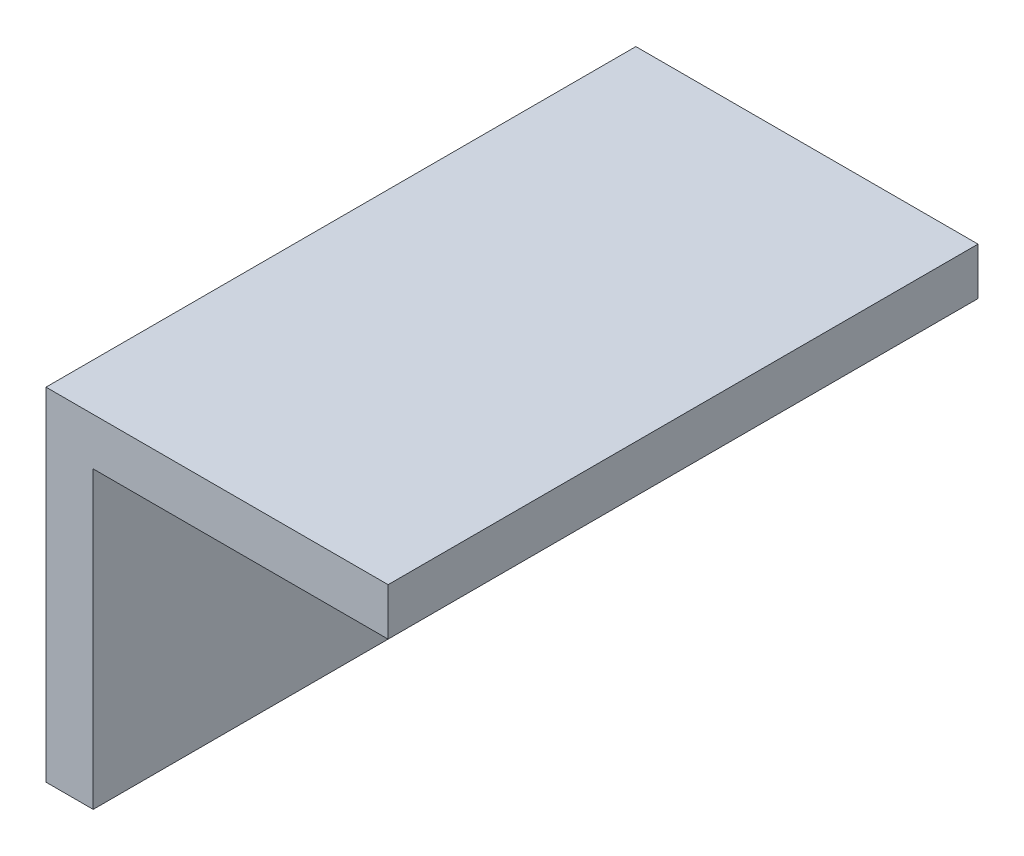
ISO-10303-21;
HEADER;
FILE_DESCRIPTION(('STEP AP214'),'2;1');
FILE_NAME('part.step','',(''),(''),'','','');
FILE_SCHEMA(('AUTOMOTIVE_DESIGN { 1 0 10303 214 1 1 1 1 }'));
ENDSEC;
DATA;
#1=APPLICATION_CONTEXT('core data for automotive mechanical design processes');
#2=APPLICATION_PROTOCOL_DEFINITION('international standard','automotive_design',2000,#1);
#3=PRODUCT_CONTEXT('',#1,'mechanical');
#4=PRODUCT('Part','Part','',(#3));
#5=PRODUCT_RELATED_PRODUCT_CATEGORY('part','',(#4));
#6=PRODUCT_DEFINITION_FORMATION('','',#4);
#7=PRODUCT_DEFINITION_CONTEXT('part definition',#1,'design');
#8=PRODUCT_DEFINITION('design','',#6,#7);
#9=PRODUCT_DEFINITION_SHAPE('','',#8);
#10=(LENGTH_UNIT() NAMED_UNIT(*) SI_UNIT(.MILLI.,.METRE.));
#11=(NAMED_UNIT(*) PLANE_ANGLE_UNIT() SI_UNIT($,.RADIAN.));
#12=(NAMED_UNIT(*) SI_UNIT($,.STERADIAN.) SOLID_ANGLE_UNIT());
#13=UNCERTAINTY_MEASURE_WITH_UNIT(LENGTH_MEASURE(1.E-05),#10,'distance_accuracy_value','');
#14=(GEOMETRIC_REPRESENTATION_CONTEXT(3) GLOBAL_UNCERTAINTY_ASSIGNED_CONTEXT((#13)) GLOBAL_UNIT_ASSIGNED_CONTEXT((#10,
#11,#12)) REPRESENTATION_CONTEXT('',''));
#15=CARTESIAN_POINT('',(0.,0.,0.));
#16=DIRECTION('',(0.,0.,1.));
#17=DIRECTION('',(1.,0.,0.));
#18=AXIS2_PLACEMENT_3D('',#15,#16,#17);
#19=CARTESIAN_POINT('',(0.,0.,50.));
#20=DIRECTION('',(-1.,0.,0.));
#21=DIRECTION('',(0.,-1.,0.));
#22=AXIS2_PLACEMENT_3D('',#19,#20,#21);
#23=PLANE('',#22);
#24=DIRECTION('',(0.,1.,0.));
#25=VECTOR('',#24,1.);
#26=CARTESIAN_POINT('',(0.,0.,-50.));
#27=LINE('',#26,#25);
#28=CARTESIAN_POINT('',(0.,-50.,-50.));
#29=VERTEX_POINT('',#28);
#30=CARTESIAN_POINT('',(0.,0.,-50.));
#31=VERTEX_POINT('',#30);
#32=EDGE_CURVE('E134',#29,#31,#27,.T.);
#33=ORIENTED_EDGE('',*,*,#32,.T.);
#34=DIRECTION('',(0.,0.,-1.));
#35=VECTOR('',#34,1.);
#36=CARTESIAN_POINT('',(0.,0.,50.));
#37=LINE('',#36,#35);
#38=CARTESIAN_POINT('',(0.,0.,50.));
#39=VERTEX_POINT('',#38);
#40=EDGE_CURVE('E11',#39,#31,#37,.T.);
#41=ORIENTED_EDGE('',*,*,#40,.F.);
#42=DIRECTION('',(0.,1.,0.));
#43=VECTOR('',#42,1.);
#44=CARTESIAN_POINT('',(0.,0.,50.));
#45=LINE('',#44,#43);
#46=CARTESIAN_POINT('',(0.,-50.,50.));
#47=VERTEX_POINT('',#46);
#48=EDGE_CURVE('E150',#47,#39,#45,.T.);
#49=ORIENTED_EDGE('',*,*,#48,.F.);
#50=DIRECTION('',(0.,0.,-1.));
#51=VECTOR('',#50,1.);
#52=CARTESIAN_POINT('',(0.,-50.,50.));
#53=LINE('',#52,#51);
#54=EDGE_CURVE('E130',#47,#29,#53,.T.);
#55=ORIENTED_EDGE('',*,*,#54,.T.);
#56=EDGE_LOOP('',(#33,#41,#49,#55));
#57=FACE_BOUND('',#56,.T.);
#58=ADVANCED_FACE('F45',(#57),#23,.F.);
#59=CARTESIAN_POINT('',(0.,0.,50.));
#60=DIRECTION('',(0.,1.,0.));
#61=DIRECTION('',(0.,0.,1.));
#62=AXIS2_PLACEMENT_3D('',#59,#60,#61);
#63=PLANE('',#62);
#64=DIRECTION('',(1.,0.,0.));
#65=VECTOR('',#64,1.);
#66=CARTESIAN_POINT('',(0.,0.,-50.));
#67=LINE('',#66,#65);
#68=CARTESIAN_POINT('',(50.,0.,-50.));
#69=VERTEX_POINT('',#68);
#70=EDGE_CURVE('E138',#31,#69,#67,.T.);
#71=ORIENTED_EDGE('',*,*,#70,.T.);
#72=DIRECTION('',(0.,0.,-1.));
#73=VECTOR('',#72,1.);
#74=CARTESIAN_POINT('',(50.,0.,50.));
#75=LINE('',#74,#73);
#76=CARTESIAN_POINT('',(50.,0.,50.));
#77=VERTEX_POINT('',#76);
#78=EDGE_CURVE('E54',#77,#69,#75,.T.);
#79=ORIENTED_EDGE('',*,*,#78,.F.);
#80=DIRECTION('',(1.,0.,0.));
#81=VECTOR('',#80,1.);
#82=CARTESIAN_POINT('',(0.,0.,50.));
#83=LINE('',#82,#81);
#84=EDGE_CURVE('E99',#39,#77,#83,.T.);
#85=ORIENTED_EDGE('',*,*,#84,.F.);
#86=ORIENTED_EDGE('',*,*,#40,.T.);
#87=EDGE_LOOP('',(#71,#79,#85,#86));
#88=FACE_BOUND('',#87,.T.);
#89=ADVANCED_FACE('F178',(#88),#63,.F.);
#90=CARTESIAN_POINT('',(50.,0.,50.));
#91=DIRECTION('',(-1.,0.,0.));
#92=DIRECTION('',(0.,0.,1.));
#93=AXIS2_PLACEMENT_3D('',#90,#91,#92);
#94=PLANE('',#93);
#95=DIRECTION('',(0.,1.,0.));
#96=VECTOR('',#95,1.);
#97=CARTESIAN_POINT('',(50.,0.,-50.));
#98=LINE('',#97,#96);
#99=CARTESIAN_POINT('',(50.,8.,-50.));
#100=VERTEX_POINT('',#99);
#101=EDGE_CURVE('E141',#69,#100,#98,.T.);
#102=ORIENTED_EDGE('',*,*,#101,.T.);
#103=DIRECTION('',(0.,0.,-1.));
#104=VECTOR('',#103,1.);
#105=CARTESIAN_POINT('',(50.,8.,50.));
#106=LINE('',#105,#104);
#107=CARTESIAN_POINT('',(50.,8.,50.));
#108=VERTEX_POINT('',#107);
#109=EDGE_CURVE('E123',#108,#100,#106,.T.);
#110=ORIENTED_EDGE('',*,*,#109,.F.);
#111=DIRECTION('',(0.,1.,0.));
#112=VECTOR('',#111,1.);
#113=CARTESIAN_POINT('',(50.,0.,50.));
#114=LINE('',#113,#112);
#115=EDGE_CURVE('E112',#77,#108,#114,.T.);
#116=ORIENTED_EDGE('',*,*,#115,.F.);
#117=ORIENTED_EDGE('',*,*,#78,.T.);
#118=EDGE_LOOP('',(#102,#110,#116,#117));
#119=FACE_BOUND('',#118,.T.);
#120=ADVANCED_FACE('F160',(#119),#94,.F.);
#121=CARTESIAN_POINT('',(-8.,8.,50.));
#122=DIRECTION('',(0.,-1.,0.));
#123=DIRECTION('',(0.,0.,-1.));
#124=AXIS2_PLACEMENT_3D('',#121,#122,#123);
#125=PLANE('',#124);
#126=DIRECTION('',(-1.,0.,0.));
#127=VECTOR('',#126,1.);
#128=CARTESIAN_POINT('',(-8.,8.,-50.));
#129=LINE('',#128,#127);
#130=CARTESIAN_POINT('',(-8.,8.,-50.));
#131=VERTEX_POINT('',#130);
#132=EDGE_CURVE('E121',#100,#131,#129,.T.);
#133=ORIENTED_EDGE('',*,*,#132,.T.);
#134=DIRECTION('',(0.,0.,-1.));
#135=VECTOR('',#134,1.);
#136=CARTESIAN_POINT('',(-8.,8.,50.));
#137=LINE('',#136,#135);
#138=CARTESIAN_POINT('',(-8.,8.,50.));
#139=VERTEX_POINT('',#138);
#140=EDGE_CURVE('E118',#139,#131,#137,.T.);
#141=ORIENTED_EDGE('',*,*,#140,.F.);
#142=DIRECTION('',(-1.,0.,0.));
#143=VECTOR('',#142,1.);
#144=CARTESIAN_POINT('',(-8.,8.,50.));
#145=LINE('',#144,#143);
#146=EDGE_CURVE('E106',#108,#139,#145,.T.);
#147=ORIENTED_EDGE('',*,*,#146,.F.);
#148=ORIENTED_EDGE('',*,*,#109,.T.);
#149=EDGE_LOOP('',(#133,#141,#147,#148));
#150=FACE_BOUND('',#149,.T.);
#151=ADVANCED_FACE('F119',(#150),#125,.F.);
#152=CARTESIAN_POINT('',(-8.,8.,50.));
#153=DIRECTION('',(1.,0.,0.));
#154=DIRECTION('',(0.,1.,0.));
#155=AXIS2_PLACEMENT_3D('',#152,#153,#154);
#156=PLANE('',#155);
#157=DIRECTION('',(0.,-1.,0.));
#158=VECTOR('',#157,1.);
#159=CARTESIAN_POINT('',(-8.,8.,-50.));
#160=LINE('',#159,#158);
#161=CARTESIAN_POINT('',(-7.99999999999999,-50.,-50.));
#162=VERTEX_POINT('',#161);
#163=EDGE_CURVE('E85',#131,#162,#160,.T.);
#164=ORIENTED_EDGE('',*,*,#163,.T.);
#165=DIRECTION('',(0.,0.,-1.));
#166=VECTOR('',#165,1.);
#167=CARTESIAN_POINT('',(-7.99999999999999,-50.,50.));
#168=LINE('',#167,#166);
#169=CARTESIAN_POINT('',(-7.99999999999999,-50.,50.));
#170=VERTEX_POINT('',#169);
#171=EDGE_CURVE('E124',#170,#162,#168,.T.);
#172=ORIENTED_EDGE('',*,*,#171,.F.);
#173=DIRECTION('',(0.,-1.,0.));
#174=VECTOR('',#173,1.);
#175=CARTESIAN_POINT('',(-8.,8.,50.));
#176=LINE('',#175,#174);
#177=EDGE_CURVE('E110',#139,#170,#176,.T.);
#178=ORIENTED_EDGE('',*,*,#177,.F.);
#179=ORIENTED_EDGE('',*,*,#140,.T.);
#180=EDGE_LOOP('',(#164,#172,#178,#179));
#181=FACE_BOUND('',#180,.T.);
#182=ADVANCED_FACE('F126',(#181),#156,.F.);
#183=CARTESIAN_POINT('',(0.,-50.,50.));
#184=DIRECTION('',(0.,1.,0.));
#185=DIRECTION('',(0.,0.,1.));
#186=AXIS2_PLACEMENT_3D('',#183,#184,#185);
#187=PLANE('',#186);
#188=DIRECTION('',(1.,0.,0.));
#189=VECTOR('',#188,1.);
#190=CARTESIAN_POINT('',(0.,-50.,-50.));
#191=LINE('',#190,#189);
#192=EDGE_CURVE('E91',#162,#29,#191,.T.);
#193=ORIENTED_EDGE('',*,*,#192,.T.);
#194=ORIENTED_EDGE('',*,*,#54,.F.);
#195=DIRECTION('',(1.,0.,0.));
#196=VECTOR('',#195,1.);
#197=CARTESIAN_POINT('',(0.,-50.,50.));
#198=LINE('',#197,#196);
#199=EDGE_CURVE('E62',#170,#47,#198,.T.);
#200=ORIENTED_EDGE('',*,*,#199,.F.);
#201=ORIENTED_EDGE('',*,*,#171,.T.);
#202=EDGE_LOOP('',(#193,#194,#200,#201));
#203=FACE_BOUND('',#202,.T.);
#204=ADVANCED_FACE('F167',(#203),#187,.F.);
#205=CARTESIAN_POINT('',(0.,0.,50.));
#206=DIRECTION('',(0.,0.,-1.));
#207=DIRECTION('',(-1.,0.,0.));
#208=AXIS2_PLACEMENT_3D('',#205,#206,#207);
#209=PLANE('',#208);
#210=ORIENTED_EDGE('',*,*,#48,.T.);
#211=ORIENTED_EDGE('',*,*,#84,.T.);
#212=ORIENTED_EDGE('',*,*,#115,.T.);
#213=ORIENTED_EDGE('',*,*,#146,.T.);
#214=ORIENTED_EDGE('',*,*,#177,.T.);
#215=ORIENTED_EDGE('',*,*,#199,.T.);
#216=EDGE_LOOP('',(#210,#211,#212,#213,#214,#215));
#217=FACE_BOUND('',#216,.T.);
#218=ADVANCED_FACE('F108',(#217),#209,.F.);
#219=CARTESIAN_POINT('',(0.,0.,-50.));
#220=DIRECTION('',(0.,0.,-1.));
#221=DIRECTION('',(-1.,0.,0.));
#222=AXIS2_PLACEMENT_3D('',#219,#220,#221);
#223=PLANE('',#222);
#224=ORIENTED_EDGE('',*,*,#32,.F.);
#225=ORIENTED_EDGE('',*,*,#192,.F.);
#226=ORIENTED_EDGE('',*,*,#163,.F.);
#227=ORIENTED_EDGE('',*,*,#132,.F.);
#228=ORIENTED_EDGE('',*,*,#101,.F.);
#229=ORIENTED_EDGE('',*,*,#70,.F.);
#230=EDGE_LOOP('',(#224,#225,#226,#227,#228,#229));
#231=FACE_BOUND('',#230,.T.);
#232=ADVANCED_FACE('F163',(#231),#223,.T.);
#233=CLOSED_SHELL('',(#58,#89,#120,#151,#182,#204,#218,#232));
#234=MANIFOLD_SOLID_BREP('B2',#233);
#235=ADVANCED_BREP_SHAPE_REPRESENTATION('',(#18,#234),#14);
#236=SHAPE_DEFINITION_REPRESENTATION(#9,#235);
ENDSEC;
END-ISO-10303-21;
